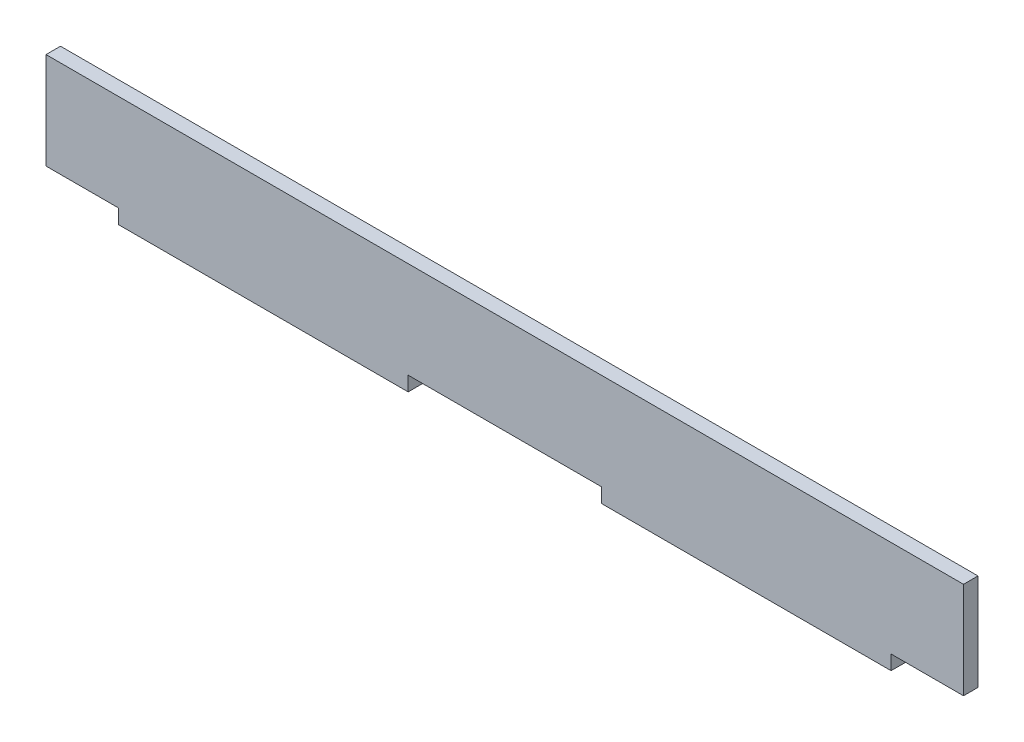
ISO-10303-21;
HEADER;
FILE_DESCRIPTION(('STEP AP214'),'2;1');
FILE_NAME('part.step','',(''),(''),'','','');
FILE_SCHEMA(('AUTOMOTIVE_DESIGN { 1 0 10303 214 1 1 1 1 }'));
ENDSEC;
DATA;
#1=APPLICATION_CONTEXT('core data for automotive mechanical design processes');
#2=APPLICATION_PROTOCOL_DEFINITION('international standard','automotive_design',2000,#1);
#3=PRODUCT_CONTEXT('',#1,'mechanical');
#4=PRODUCT('Part','Part','',(#3));
#5=PRODUCT_RELATED_PRODUCT_CATEGORY('part','',(#4));
#6=PRODUCT_DEFINITION_FORMATION('','',#4);
#7=PRODUCT_DEFINITION_CONTEXT('part definition',#1,'design');
#8=PRODUCT_DEFINITION('design','',#6,#7);
#9=PRODUCT_DEFINITION_SHAPE('','',#8);
#10=(LENGTH_UNIT() NAMED_UNIT(*) SI_UNIT(.MILLI.,.METRE.));
#11=(NAMED_UNIT(*) PLANE_ANGLE_UNIT() SI_UNIT($,.RADIAN.));
#12=(NAMED_UNIT(*) SI_UNIT($,.STERADIAN.) SOLID_ANGLE_UNIT());
#13=UNCERTAINTY_MEASURE_WITH_UNIT(LENGTH_MEASURE(1.E-05),#10,'distance_accuracy_value','');
#14=(GEOMETRIC_REPRESENTATION_CONTEXT(3) GLOBAL_UNCERTAINTY_ASSIGNED_CONTEXT((#13)) GLOBAL_UNIT_ASSIGNED_CONTEXT((#10,
#11,#12)) REPRESENTATION_CONTEXT('',''));
#15=CARTESIAN_POINT('',(0.,0.,0.));
#16=DIRECTION('',(0.,0.,1.));
#17=DIRECTION('',(1.,0.,0.));
#18=AXIS2_PLACEMENT_3D('',#15,#16,#17);
#19=CARTESIAN_POINT('',(0.,0.,3.));
#20=DIRECTION('',(1.,0.,0.));
#21=DIRECTION('',(0.,0.,-1.));
#22=AXIS2_PLACEMENT_3D('',#19,#20,#21);
#23=PLANE('',#22);
#24=DIRECTION('',(0.,-1.,0.));
#25=VECTOR('',#24,1.);
#26=CARTESIAN_POINT('',(0.,0.,0.));
#27=LINE('',#26,#25);
#28=CARTESIAN_POINT('',(0.,20.,0.));
#29=VERTEX_POINT('',#28);
#30=CARTESIAN_POINT('',(0.,0.,0.));
#31=VERTEX_POINT('',#30);
#32=EDGE_CURVE('E166',#29,#31,#27,.T.);
#33=ORIENTED_EDGE('',*,*,#32,.T.);
#34=DIRECTION('',(0.,0.,-1.));
#35=VECTOR('',#34,1.);
#36=CARTESIAN_POINT('',(0.,0.,3.));
#37=LINE('',#36,#35);
#38=CARTESIAN_POINT('',(0.,0.,3.));
#39=VERTEX_POINT('',#38);
#40=EDGE_CURVE('E11',#39,#31,#37,.T.);
#41=ORIENTED_EDGE('',*,*,#40,.F.);
#42=DIRECTION('',(0.,-1.,0.));
#43=VECTOR('',#42,1.);
#44=CARTESIAN_POINT('',(0.,0.,3.));
#45=LINE('',#44,#43);
#46=CARTESIAN_POINT('',(0.,20.,3.));
#47=VERTEX_POINT('',#46);
#48=EDGE_CURVE('E200',#47,#39,#45,.T.);
#49=ORIENTED_EDGE('',*,*,#48,.F.);
#50=DIRECTION('',(0.,0.,-1.));
#51=VECTOR('',#50,1.);
#52=CARTESIAN_POINT('',(0.,20.,3.));
#53=LINE('',#52,#51);
#54=EDGE_CURVE('E162',#47,#29,#53,.T.);
#55=ORIENTED_EDGE('',*,*,#54,.T.);
#56=EDGE_LOOP('',(#33,#41,#49,#55));
#57=FACE_BOUND('',#56,.T.);
#58=ADVANCED_FACE('F41',(#57),#23,.F.);
#59=CARTESIAN_POINT('',(0.,0.,3.));
#60=DIRECTION('',(0.,1.,0.));
#61=DIRECTION('',(-1.,0.,0.));
#62=AXIS2_PLACEMENT_3D('',#59,#60,#61);
#63=PLANE('',#62);
#64=DIRECTION('',(1.,0.,0.));
#65=VECTOR('',#64,1.);
#66=CARTESIAN_POINT('',(0.,0.,0.));
#67=LINE('',#66,#65);
#68=CARTESIAN_POINT('',(15.,0.,0.));
#69=VERTEX_POINT('',#68);
#70=EDGE_CURVE('E170',#31,#69,#67,.T.);
#71=ORIENTED_EDGE('',*,*,#70,.T.);
#72=DIRECTION('',(0.,0.,-1.));
#73=VECTOR('',#72,1.);
#74=CARTESIAN_POINT('',(15.,0.,3.));
#75=LINE('',#74,#73);
#76=CARTESIAN_POINT('',(15.,0.,3.));
#77=VERTEX_POINT('',#76);
#78=EDGE_CURVE('E50',#77,#69,#75,.T.);
#79=ORIENTED_EDGE('',*,*,#78,.F.);
#80=DIRECTION('',(1.,0.,0.));
#81=VECTOR('',#80,1.);
#82=CARTESIAN_POINT('',(0.,0.,3.));
#83=LINE('',#82,#81);
#84=EDGE_CURVE('E113',#39,#77,#83,.T.);
#85=ORIENTED_EDGE('',*,*,#84,.F.);
#86=ORIENTED_EDGE('',*,*,#40,.T.);
#87=EDGE_LOOP('',(#71,#79,#85,#86));
#88=FACE_BOUND('',#87,.T.);
#89=ADVANCED_FACE('F294',(#88),#63,.F.);
#90=CARTESIAN_POINT('',(15.,0.,3.));
#91=DIRECTION('',(1.,0.,0.));
#92=DIRECTION('',(0.,0.,-1.));
#93=AXIS2_PLACEMENT_3D('',#90,#91,#92);
#94=PLANE('',#93);
#95=DIRECTION('',(0.,-1.,0.));
#96=VECTOR('',#95,1.);
#97=CARTESIAN_POINT('',(15.,0.,0.));
#98=LINE('',#97,#96);
#99=CARTESIAN_POINT('',(15.,-3.00000000000002,0.));
#100=VERTEX_POINT('',#99);
#101=EDGE_CURVE('E173',#69,#100,#98,.T.);
#102=ORIENTED_EDGE('',*,*,#101,.T.);
#103=DIRECTION('',(0.,0.,-1.));
#104=VECTOR('',#103,1.);
#105=CARTESIAN_POINT('',(15.,-3.00000000000002,3.));
#106=LINE('',#105,#104);
#107=CARTESIAN_POINT('',(15.,-3.00000000000002,3.));
#108=VERTEX_POINT('',#107);
#109=EDGE_CURVE('E227',#108,#100,#106,.T.);
#110=ORIENTED_EDGE('',*,*,#109,.F.);
#111=DIRECTION('',(0.,-1.,0.));
#112=VECTOR('',#111,1.);
#113=CARTESIAN_POINT('',(15.,0.,3.));
#114=LINE('',#113,#112);
#115=EDGE_CURVE('E237',#77,#108,#114,.T.);
#116=ORIENTED_EDGE('',*,*,#115,.F.);
#117=ORIENTED_EDGE('',*,*,#78,.T.);
#118=EDGE_LOOP('',(#102,#110,#116,#117));
#119=FACE_BOUND('',#118,.T.);
#120=ADVANCED_FACE('F235',(#119),#94,.F.);
#121=CARTESIAN_POINT('',(15.,-3.00000000000002,3.));
#122=DIRECTION('',(0.,1.,0.));
#123=DIRECTION('',(-1.,0.,0.));
#124=AXIS2_PLACEMENT_3D('',#121,#122,#123);
#125=PLANE('',#124);
#126=DIRECTION('',(1.,0.,0.));
#127=VECTOR('',#126,1.);
#128=CARTESIAN_POINT('',(15.,-3.00000000000002,0.));
#129=LINE('',#128,#127);
#130=CARTESIAN_POINT('',(75.,-3.00000000000001,0.));
#131=VERTEX_POINT('',#130);
#132=EDGE_CURVE('E176',#100,#131,#129,.T.);
#133=ORIENTED_EDGE('',*,*,#132,.T.);
#134=DIRECTION('',(0.,0.,-1.));
#135=VECTOR('',#134,1.);
#136=CARTESIAN_POINT('',(75.,-3.00000000000001,3.));
#137=LINE('',#136,#135);
#138=CARTESIAN_POINT('',(75.,-3.00000000000001,3.));
#139=VERTEX_POINT('',#138);
#140=EDGE_CURVE('E223',#139,#131,#137,.T.);
#141=ORIENTED_EDGE('',*,*,#140,.F.);
#142=DIRECTION('',(1.,0.,0.));
#143=VECTOR('',#142,1.);
#144=CARTESIAN_POINT('',(15.,-3.00000000000002,3.));
#145=LINE('',#144,#143);
#146=EDGE_CURVE('E256',#108,#139,#145,.T.);
#147=ORIENTED_EDGE('',*,*,#146,.F.);
#148=ORIENTED_EDGE('',*,*,#109,.T.);
#149=EDGE_LOOP('',(#133,#141,#147,#148));
#150=FACE_BOUND('',#149,.T.);
#151=ADVANCED_FACE('F246',(#150),#125,.F.);
#152=CARTESIAN_POINT('',(75.,0.,3.));
#153=DIRECTION('',(-1.,0.,0.));
#154=DIRECTION('',(0.,0.,1.));
#155=AXIS2_PLACEMENT_3D('',#152,#153,#154);
#156=PLANE('',#155);
#157=DIRECTION('',(0.,1.,0.));
#158=VECTOR('',#157,1.);
#159=CARTESIAN_POINT('',(75.,0.,0.));
#160=LINE('',#159,#158);
#161=CARTESIAN_POINT('',(75.,0.,0.));
#162=VERTEX_POINT('',#161);
#163=EDGE_CURVE('E179',#131,#162,#160,.T.);
#164=ORIENTED_EDGE('',*,*,#163,.T.);
#165=DIRECTION('',(0.,0.,-1.));
#166=VECTOR('',#165,1.);
#167=CARTESIAN_POINT('',(75.,0.,3.));
#168=LINE('',#167,#166);
#169=CARTESIAN_POINT('',(75.,0.,3.));
#170=VERTEX_POINT('',#169);
#171=EDGE_CURVE('E219',#170,#162,#168,.T.);
#172=ORIENTED_EDGE('',*,*,#171,.F.);
#173=DIRECTION('',(0.,1.,0.));
#174=VECTOR('',#173,1.);
#175=CARTESIAN_POINT('',(75.,0.,3.));
#176=LINE('',#175,#174);
#177=EDGE_CURVE('E252',#139,#170,#176,.T.);
#178=ORIENTED_EDGE('',*,*,#177,.F.);
#179=ORIENTED_EDGE('',*,*,#140,.T.);
#180=EDGE_LOOP('',(#164,#172,#178,#179));
#181=FACE_BOUND('',#180,.T.);
#182=ADVANCED_FACE('F250',(#181),#156,.F.);
#183=CARTESIAN_POINT('',(75.,0.,3.));
#184=DIRECTION('',(0.,1.,0.));
#185=DIRECTION('',(-1.,0.,0.));
#186=AXIS2_PLACEMENT_3D('',#183,#184,#185);
#187=PLANE('',#186);
#188=DIRECTION('',(1.,0.,0.));
#189=VECTOR('',#188,1.);
#190=CARTESIAN_POINT('',(75.,0.,0.));
#191=LINE('',#190,#189);
#192=CARTESIAN_POINT('',(115.,0.,0.));
#193=VERTEX_POINT('',#192);
#194=EDGE_CURVE('E182',#162,#193,#191,.T.);
#195=ORIENTED_EDGE('',*,*,#194,.T.);
#196=DIRECTION('',(0.,0.,-1.));
#197=VECTOR('',#196,1.);
#198=CARTESIAN_POINT('',(115.,0.,3.));
#199=LINE('',#198,#197);
#200=CARTESIAN_POINT('',(115.,0.,3.));
#201=VERTEX_POINT('',#200);
#202=EDGE_CURVE('E215',#201,#193,#199,.T.);
#203=ORIENTED_EDGE('',*,*,#202,.F.);
#204=DIRECTION('',(1.,0.,0.));
#205=VECTOR('',#204,1.);
#206=CARTESIAN_POINT('',(75.,0.,3.));
#207=LINE('',#206,#205);
#208=EDGE_CURVE('E255',#170,#201,#207,.T.);
#209=ORIENTED_EDGE('',*,*,#208,.F.);
#210=ORIENTED_EDGE('',*,*,#171,.T.);
#211=EDGE_LOOP('',(#195,#203,#209,#210));
#212=FACE_BOUND('',#211,.T.);
#213=ADVANCED_FACE('F307',(#212),#187,.F.);
#214=CARTESIAN_POINT('',(115.,0.,3.));
#215=DIRECTION('',(1.,0.,0.));
#216=DIRECTION('',(0.,0.,-1.));
#217=AXIS2_PLACEMENT_3D('',#214,#215,#216);
#218=PLANE('',#217);
#219=DIRECTION('',(0.,-1.,0.));
#220=VECTOR('',#219,1.);
#221=CARTESIAN_POINT('',(115.,0.,0.));
#222=LINE('',#221,#220);
#223=CARTESIAN_POINT('',(115.,-3.00000000000001,0.));
#224=VERTEX_POINT('',#223);
#225=EDGE_CURVE('E185',#193,#224,#222,.T.);
#226=ORIENTED_EDGE('',*,*,#225,.T.);
#227=DIRECTION('',(0.,0.,-1.));
#228=VECTOR('',#227,1.);
#229=CARTESIAN_POINT('',(115.,-3.00000000000001,3.));
#230=LINE('',#229,#228);
#231=CARTESIAN_POINT('',(115.,-3.00000000000001,3.));
#232=VERTEX_POINT('',#231);
#233=EDGE_CURVE('E211',#232,#224,#230,.T.);
#234=ORIENTED_EDGE('',*,*,#233,.F.);
#235=DIRECTION('',(0.,-1.,0.));
#236=VECTOR('',#235,1.);
#237=CARTESIAN_POINT('',(115.,0.,3.));
#238=LINE('',#237,#236);
#239=EDGE_CURVE('E260',#201,#232,#238,.T.);
#240=ORIENTED_EDGE('',*,*,#239,.F.);
#241=ORIENTED_EDGE('',*,*,#202,.T.);
#242=EDGE_LOOP('',(#226,#234,#240,#241));
#243=FACE_BOUND('',#242,.T.);
#244=ADVANCED_FACE('F310',(#243),#218,.F.);
#245=CARTESIAN_POINT('',(175.,-3.,3.));
#246=DIRECTION('',(0.,1.,0.));
#247=DIRECTION('',(-1.,0.,0.));
#248=AXIS2_PLACEMENT_3D('',#245,#246,#247);
#249=PLANE('',#248);
#250=DIRECTION('',(1.,0.,0.));
#251=VECTOR('',#250,1.);
#252=CARTESIAN_POINT('',(175.,-3.,0.));
#253=LINE('',#252,#251);
#254=CARTESIAN_POINT('',(175.,-3.,0.));
#255=VERTEX_POINT('',#254);
#256=EDGE_CURVE('E188',#224,#255,#253,.T.);
#257=ORIENTED_EDGE('',*,*,#256,.T.);
#258=DIRECTION('',(0.,0.,-1.));
#259=VECTOR('',#258,1.);
#260=CARTESIAN_POINT('',(175.,-3.,3.));
#261=LINE('',#260,#259);
#262=CARTESIAN_POINT('',(175.,-3.,3.));
#263=VERTEX_POINT('',#262);
#264=EDGE_CURVE('E207',#263,#255,#261,.T.);
#265=ORIENTED_EDGE('',*,*,#264,.F.);
#266=DIRECTION('',(1.,0.,0.));
#267=VECTOR('',#266,1.);
#268=CARTESIAN_POINT('',(175.,-3.,3.));
#269=LINE('',#268,#267);
#270=EDGE_CURVE('E267',#232,#263,#269,.T.);
#271=ORIENTED_EDGE('',*,*,#270,.F.);
#272=ORIENTED_EDGE('',*,*,#233,.T.);
#273=EDGE_LOOP('',(#257,#265,#271,#272));
#274=FACE_BOUND('',#273,.T.);
#275=ADVANCED_FACE('F275',(#274),#249,.F.);
#276=CARTESIAN_POINT('',(175.,0.,3.));
#277=DIRECTION('',(-1.,0.,0.));
#278=DIRECTION('',(0.,0.,1.));
#279=AXIS2_PLACEMENT_3D('',#276,#277,#278);
#280=PLANE('',#279);
#281=DIRECTION('',(0.,1.,0.));
#282=VECTOR('',#281,1.);
#283=CARTESIAN_POINT('',(175.,0.,0.));
#284=LINE('',#283,#282);
#285=CARTESIAN_POINT('',(175.,0.,0.));
#286=VERTEX_POINT('',#285);
#287=EDGE_CURVE('E191',#255,#286,#284,.T.);
#288=ORIENTED_EDGE('',*,*,#287,.T.);
#289=DIRECTION('',(0.,0.,-1.));
#290=VECTOR('',#289,1.);
#291=CARTESIAN_POINT('',(175.,0.,3.));
#292=LINE('',#291,#290);
#293=CARTESIAN_POINT('',(175.,0.,3.));
#294=VERTEX_POINT('',#293);
#295=EDGE_CURVE('E155',#294,#286,#292,.T.);
#296=ORIENTED_EDGE('',*,*,#295,.F.);
#297=DIRECTION('',(0.,1.,0.));
#298=VECTOR('',#297,1.);
#299=CARTESIAN_POINT('',(175.,0.,3.));
#300=LINE('',#299,#298);
#301=EDGE_CURVE('E144',#263,#294,#300,.T.);
#302=ORIENTED_EDGE('',*,*,#301,.F.);
#303=ORIENTED_EDGE('',*,*,#264,.T.);
#304=EDGE_LOOP('',(#288,#296,#302,#303));
#305=FACE_BOUND('',#304,.T.);
#306=ADVANCED_FACE('F279',(#305),#280,.F.);
#307=CARTESIAN_POINT('',(175.,0.,3.));
#308=DIRECTION('',(0.,1.,0.));
#309=DIRECTION('',(-1.,0.,0.));
#310=AXIS2_PLACEMENT_3D('',#307,#308,#309);
#311=PLANE('',#310);
#312=DIRECTION('',(1.,0.,0.));
#313=VECTOR('',#312,1.);
#314=CARTESIAN_POINT('',(175.,0.,0.));
#315=LINE('',#314,#313);
#316=CARTESIAN_POINT('',(190.,0.,0.));
#317=VERTEX_POINT('',#316);
#318=EDGE_CURVE('E153',#286,#317,#315,.T.);
#319=ORIENTED_EDGE('',*,*,#318,.T.);
#320=DIRECTION('',(0.,0.,-1.));
#321=VECTOR('',#320,1.);
#322=CARTESIAN_POINT('',(190.,0.,3.));
#323=LINE('',#322,#321);
#324=CARTESIAN_POINT('',(190.,0.,3.));
#325=VERTEX_POINT('',#324);
#326=EDGE_CURVE('E150',#325,#317,#323,.T.);
#327=ORIENTED_EDGE('',*,*,#326,.F.);
#328=DIRECTION('',(1.,0.,0.));
#329=VECTOR('',#328,1.);
#330=CARTESIAN_POINT('',(175.,0.,3.));
#331=LINE('',#330,#329);
#332=EDGE_CURVE('E138',#294,#325,#331,.T.);
#333=ORIENTED_EDGE('',*,*,#332,.F.);
#334=ORIENTED_EDGE('',*,*,#295,.T.);
#335=EDGE_LOOP('',(#319,#327,#333,#334));
#336=FACE_BOUND('',#335,.T.);
#337=ADVANCED_FACE('F151',(#336),#311,.F.);
#338=CARTESIAN_POINT('',(190.,0.,3.));
#339=DIRECTION('',(-1.,0.,0.));
#340=DIRECTION('',(0.,0.,1.));
#341=AXIS2_PLACEMENT_3D('',#338,#339,#340);
#342=PLANE('',#341);
#343=DIRECTION('',(0.,1.,0.));
#344=VECTOR('',#343,1.);
#345=CARTESIAN_POINT('',(190.,0.,0.));
#346=LINE('',#345,#344);
#347=CARTESIAN_POINT('',(190.,20.,0.));
#348=VERTEX_POINT('',#347);
#349=EDGE_CURVE('E99',#317,#348,#346,.T.);
#350=ORIENTED_EDGE('',*,*,#349,.T.);
#351=DIRECTION('',(0.,0.,-1.));
#352=VECTOR('',#351,1.);
#353=CARTESIAN_POINT('',(190.,20.,3.));
#354=LINE('',#353,#352);
#355=CARTESIAN_POINT('',(190.,20.,3.));
#356=VERTEX_POINT('',#355);
#357=EDGE_CURVE('E156',#356,#348,#354,.T.);
#358=ORIENTED_EDGE('',*,*,#357,.F.);
#359=DIRECTION('',(0.,1.,0.));
#360=VECTOR('',#359,1.);
#361=CARTESIAN_POINT('',(190.,0.,3.));
#362=LINE('',#361,#360);
#363=EDGE_CURVE('E142',#325,#356,#362,.T.);
#364=ORIENTED_EDGE('',*,*,#363,.F.);
#365=ORIENTED_EDGE('',*,*,#326,.T.);
#366=EDGE_LOOP('',(#350,#358,#364,#365));
#367=FACE_BOUND('',#366,.T.);
#368=ADVANCED_FACE('F158',(#367),#342,.F.);
#369=CARTESIAN_POINT('',(0.,20.,3.));
#370=DIRECTION('',(0.,-1.,0.));
#371=DIRECTION('',(0.,0.,-1.));
#372=AXIS2_PLACEMENT_3D('',#369,#370,#371);
#373=PLANE('',#372);
#374=DIRECTION('',(-1.,0.,0.));
#375=VECTOR('',#374,1.);
#376=CARTESIAN_POINT('',(0.,20.,0.));
#377=LINE('',#376,#375);
#378=EDGE_CURVE('E105',#348,#29,#377,.T.);
#379=ORIENTED_EDGE('',*,*,#378,.T.);
#380=ORIENTED_EDGE('',*,*,#54,.F.);
#381=DIRECTION('',(-1.,0.,0.));
#382=VECTOR('',#381,1.);
#383=CARTESIAN_POINT('',(0.,20.,3.));
#384=LINE('',#383,#382);
#385=EDGE_CURVE('E58',#356,#47,#384,.T.);
#386=ORIENTED_EDGE('',*,*,#385,.F.);
#387=ORIENTED_EDGE('',*,*,#357,.T.);
#388=EDGE_LOOP('',(#379,#380,#386,#387));
#389=FACE_BOUND('',#388,.T.);
#390=ADVANCED_FACE('F283',(#389),#373,.F.);
#391=CARTESIAN_POINT('',(0.,0.,3.));
#392=DIRECTION('',(0.,0.,-1.));
#393=DIRECTION('',(-1.,0.,0.));
#394=AXIS2_PLACEMENT_3D('',#391,#392,#393);
#395=PLANE('',#394);
#396=ORIENTED_EDGE('',*,*,#48,.T.);
#397=ORIENTED_EDGE('',*,*,#84,.T.);
#398=ORIENTED_EDGE('',*,*,#115,.T.);
#399=ORIENTED_EDGE('',*,*,#146,.T.);
#400=ORIENTED_EDGE('',*,*,#177,.T.);
#401=ORIENTED_EDGE('',*,*,#208,.T.);
#402=ORIENTED_EDGE('',*,*,#239,.T.);
#403=ORIENTED_EDGE('',*,*,#270,.T.);
#404=ORIENTED_EDGE('',*,*,#301,.T.);
#405=ORIENTED_EDGE('',*,*,#332,.T.);
#406=ORIENTED_EDGE('',*,*,#363,.T.);
#407=ORIENTED_EDGE('',*,*,#385,.T.);
#408=EDGE_LOOP('',(#396,#397,#398,#399,#400,#401,#402,#403,#404,#405,#406,#407));
#409=FACE_BOUND('',#408,.T.);
#410=ADVANCED_FACE('F140',(#409),#395,.F.);
#411=CARTESIAN_POINT('',(0.,0.,0.));
#412=DIRECTION('',(0.,0.,-1.));
#413=DIRECTION('',(-1.,0.,0.));
#414=AXIS2_PLACEMENT_3D('',#411,#412,#413);
#415=PLANE('',#414);
#416=ORIENTED_EDGE('',*,*,#32,.F.);
#417=ORIENTED_EDGE('',*,*,#378,.F.);
#418=ORIENTED_EDGE('',*,*,#349,.F.);
#419=ORIENTED_EDGE('',*,*,#318,.F.);
#420=ORIENTED_EDGE('',*,*,#287,.F.);
#421=ORIENTED_EDGE('',*,*,#256,.F.);
#422=ORIENTED_EDGE('',*,*,#225,.F.);
#423=ORIENTED_EDGE('',*,*,#194,.F.);
#424=ORIENTED_EDGE('',*,*,#163,.F.);
#425=ORIENTED_EDGE('',*,*,#132,.F.);
#426=ORIENTED_EDGE('',*,*,#101,.F.);
#427=ORIENTED_EDGE('',*,*,#70,.F.);
#428=EDGE_LOOP('',(#416,#417,#418,#419,#420,#421,#422,#423,#424,#425,#426,#427));
#429=FACE_BOUND('',#428,.T.);
#430=ADVANCED_FACE('F241',(#429),#415,.T.);
#431=CLOSED_SHELL('',(#58,#89,#120,#151,#182,#213,#244,#275,#306,#337,#368,#390,#410,#430));
#432=MANIFOLD_SOLID_BREP('B2',#431);
#433=ADVANCED_BREP_SHAPE_REPRESENTATION('',(#18,#432),#14);
#434=SHAPE_DEFINITION_REPRESENTATION(#9,#433);
ENDSEC;
END-ISO-10303-21;
